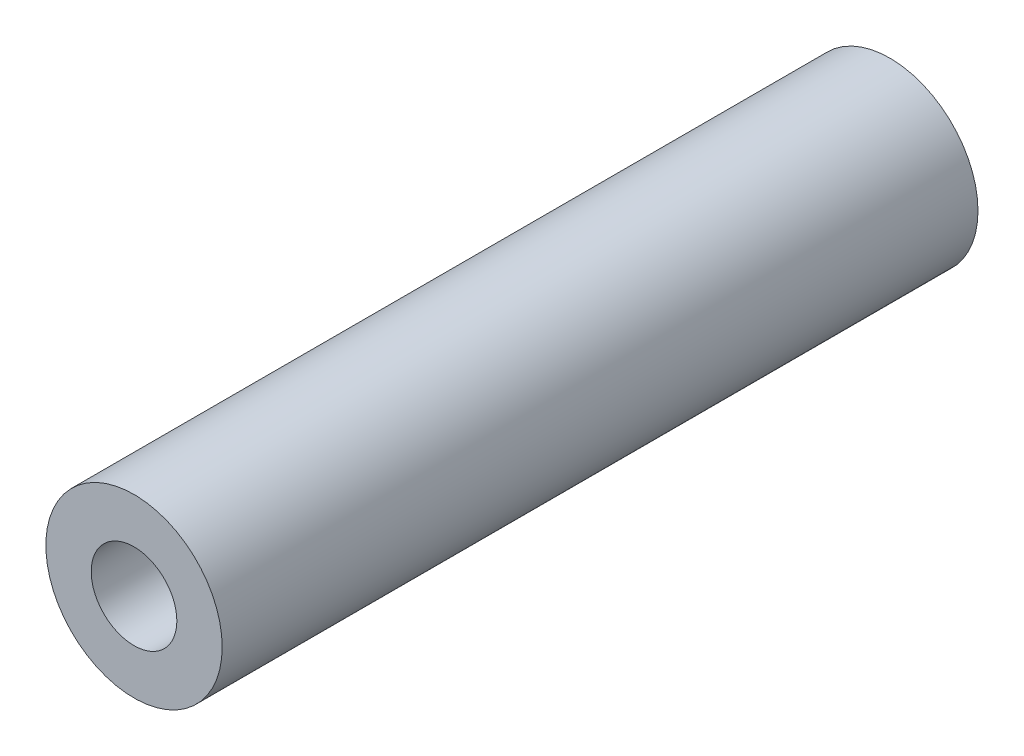
ISO-10303-21;
HEADER;
FILE_DESCRIPTION(('STEP AP214'),'2;1');
FILE_NAME('part.step','',(''),(''),'','','');
FILE_SCHEMA(('AUTOMOTIVE_DESIGN { 1 0 10303 214 1 1 1 1 }'));
ENDSEC;
DATA;
#1=APPLICATION_CONTEXT('core data for automotive mechanical design processes');
#2=APPLICATION_PROTOCOL_DEFINITION('international standard','automotive_design',2000,#1);
#3=PRODUCT_CONTEXT('',#1,'mechanical');
#4=PRODUCT('Part','Part','',(#3));
#5=PRODUCT_RELATED_PRODUCT_CATEGORY('part','',(#4));
#6=PRODUCT_DEFINITION_FORMATION('','',#4);
#7=PRODUCT_DEFINITION_CONTEXT('part definition',#1,'design');
#8=PRODUCT_DEFINITION('design','',#6,#7);
#9=PRODUCT_DEFINITION_SHAPE('','',#8);
#10=(LENGTH_UNIT() NAMED_UNIT(*) SI_UNIT(.MILLI.,.METRE.));
#11=(NAMED_UNIT(*) PLANE_ANGLE_UNIT() SI_UNIT($,.RADIAN.));
#12=(NAMED_UNIT(*) SI_UNIT($,.STERADIAN.) SOLID_ANGLE_UNIT());
#13=UNCERTAINTY_MEASURE_WITH_UNIT(LENGTH_MEASURE(1.E-05),#10,'distance_accuracy_value','');
#14=(GEOMETRIC_REPRESENTATION_CONTEXT(3) GLOBAL_UNCERTAINTY_ASSIGNED_CONTEXT((#13)) GLOBAL_UNIT_ASSIGNED_CONTEXT((#10,
#11,#12)) REPRESENTATION_CONTEXT('',''));
#15=CARTESIAN_POINT('',(0.,0.,0.));
#16=DIRECTION('',(0.,0.,1.));
#17=DIRECTION('',(1.,0.,0.));
#18=AXIS2_PLACEMENT_3D('',#15,#16,#17);
#19=CARTESIAN_POINT('',(112.,-117.,187.4));
#20=DIRECTION('',(0.,0.,1.));
#21=DIRECTION('',(1.,0.,0.));
#22=AXIS2_PLACEMENT_3D('',#19,#20,#21);
#23=CYLINDRICAL_SURFACE('',#22,1.7);
#24=DIRECTION('',(0.,0.,1.));
#25=VECTOR('',#24,1.);
#26=CARTESIAN_POINT('',(113.7,-117.,187.4));
#27=LINE('',#26,#25);
#28=CARTESIAN_POINT('',(113.7,-117.,187.5));
#29=VERTEX_POINT('',#28);
#30=CARTESIAN_POINT('',(113.7,-117.,217.5));
#31=VERTEX_POINT('',#30);
#32=EDGE_CURVE('E9',#29,#31,#27,.T.);
#33=ORIENTED_EDGE('',*,*,#32,.F.);
#34=CARTESIAN_POINT('',(112.,-117.,187.5));
#35=DIRECTION('',(0.,0.,1.));
#36=DIRECTION('',(1.,0.,0.));
#37=AXIS2_PLACEMENT_3D('',#34,#35,#36);
#38=CIRCLE('',#37,1.7);
#39=EDGE_CURVE('E23',#29,#29,#38,.T.);
#40=ORIENTED_EDGE('',*,*,#39,.F.);
#41=ORIENTED_EDGE('',*,*,#32,.T.);
#42=CARTESIAN_POINT('',(112.,-117.,217.5));
#43=DIRECTION('',(0.,0.,1.));
#44=DIRECTION('',(1.,0.,0.));
#45=AXIS2_PLACEMENT_3D('',#42,#43,#44);
#46=CIRCLE('',#45,1.7);
#47=EDGE_CURVE('E64',#31,#31,#46,.T.);
#48=ORIENTED_EDGE('',*,*,#47,.T.);
#49=EDGE_LOOP('',(#33,#40,#41,#48));
#50=FACE_BOUND('',#49,.T.);
#51=ADVANCED_FACE('F14',(#50),#23,.F.);
#52=CARTESIAN_POINT('',(112.,-117.,187.5));
#53=DIRECTION('',(0.,0.,1.));
#54=DIRECTION('',(1.,0.,0.));
#55=AXIS2_PLACEMENT_3D('',#52,#53,#54);
#56=PLANE('',#55);
#57=ORIENTED_EDGE('',*,*,#39,.T.);
#58=EDGE_LOOP('',(#57));
#59=FACE_BOUND('',#58,.T.);
#60=CARTESIAN_POINT('',(112.,-117.,187.5));
#61=DIRECTION('',(0.,0.,1.));
#62=DIRECTION('',(1.,0.,0.));
#63=AXIS2_PLACEMENT_3D('',#60,#61,#62);
#64=CIRCLE('',#63,3.5);
#65=CARTESIAN_POINT('',(115.5,-117.,187.5));
#66=VERTEX_POINT('',#65);
#67=EDGE_CURVE('E53',#66,#66,#64,.T.);
#68=ORIENTED_EDGE('',*,*,#67,.F.);
#69=EDGE_LOOP('',(#68));
#70=FACE_BOUND('',#69,.T.);
#71=ADVANCED_FACE('F73',(#59,#70),#56,.F.);
#72=CARTESIAN_POINT('',(112.,-117.,217.5));
#73=DIRECTION('',(0.,0.,1.));
#74=DIRECTION('',(1.,0.,0.));
#75=AXIS2_PLACEMENT_3D('',#72,#73,#74);
#76=PLANE('',#75);
#77=ORIENTED_EDGE('',*,*,#47,.F.);
#78=EDGE_LOOP('',(#77));
#79=FACE_BOUND('',#78,.T.);
#80=CARTESIAN_POINT('',(112.,-117.,217.5));
#81=DIRECTION('',(0.,0.,1.));
#82=DIRECTION('',(1.,0.,0.));
#83=AXIS2_PLACEMENT_3D('',#80,#81,#82);
#84=CIRCLE('',#83,3.5);
#85=CARTESIAN_POINT('',(115.5,-117.,217.5));
#86=VERTEX_POINT('',#85);
#87=EDGE_CURVE('E51',#86,#86,#84,.T.);
#88=ORIENTED_EDGE('',*,*,#87,.T.);
#89=EDGE_LOOP('',(#88));
#90=FACE_BOUND('',#89,.T.);
#91=ADVANCED_FACE('F16',(#79,#90),#76,.T.);
#92=CARTESIAN_POINT('',(112.,-117.,187.5));
#93=DIRECTION('',(0.,0.,1.));
#94=DIRECTION('',(1.,0.,0.));
#95=AXIS2_PLACEMENT_3D('',#92,#93,#94);
#96=CYLINDRICAL_SURFACE('',#95,3.5);
#97=ORIENTED_EDGE('',*,*,#87,.F.);
#98=DIRECTION('',(0.,0.,1.));
#99=VECTOR('',#98,1.);
#100=CARTESIAN_POINT('',(115.5,-117.,187.5));
#101=LINE('',#100,#99);
#102=EDGE_CURVE('E48',#66,#86,#101,.T.);
#103=ORIENTED_EDGE('',*,*,#102,.F.);
#104=ORIENTED_EDGE('',*,*,#67,.T.);
#105=ORIENTED_EDGE('',*,*,#102,.T.);
#106=EDGE_LOOP('',(#97,#103,#104,#105));
#107=FACE_BOUND('',#106,.T.);
#108=ADVANCED_FACE('F50',(#107),#96,.T.);
#109=CLOSED_SHELL('',(#51,#71,#91,#108));
#110=MANIFOLD_SOLID_BREP('B1',#109);
#111=ADVANCED_BREP_SHAPE_REPRESENTATION('',(#18,#110),#14);
#112=SHAPE_DEFINITION_REPRESENTATION(#9,#111);
ENDSEC;
END-ISO-10303-21;
